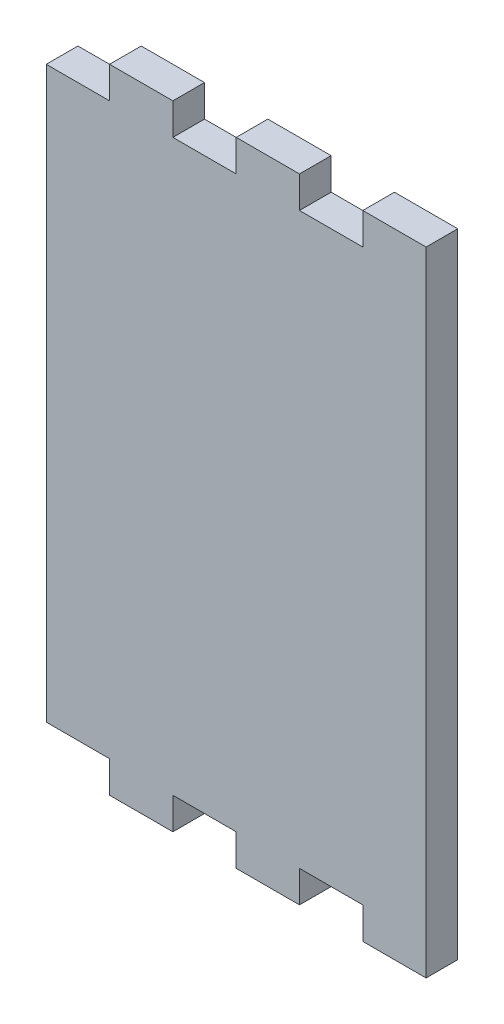
ISO-10303-21;
HEADER;
FILE_DESCRIPTION(('STEP AP214'),'2;1');
FILE_NAME('part.step','',(''),(''),'','','');
FILE_SCHEMA(('AUTOMOTIVE_DESIGN { 1 0 10303 214 1 1 1 1 }'));
ENDSEC;
DATA;
#1=APPLICATION_CONTEXT('core data for automotive mechanical design processes');
#2=APPLICATION_PROTOCOL_DEFINITION('international standard','automotive_design',2000,#1);
#3=PRODUCT_CONTEXT('',#1,'mechanical');
#4=PRODUCT('Part','Part','',(#3));
#5=PRODUCT_RELATED_PRODUCT_CATEGORY('part','',(#4));
#6=PRODUCT_DEFINITION_FORMATION('','',#4);
#7=PRODUCT_DEFINITION_CONTEXT('part definition',#1,'design');
#8=PRODUCT_DEFINITION('design','',#6,#7);
#9=PRODUCT_DEFINITION_SHAPE('','',#8);
#10=(LENGTH_UNIT() NAMED_UNIT(*) SI_UNIT(.MILLI.,.METRE.));
#11=(NAMED_UNIT(*) PLANE_ANGLE_UNIT() SI_UNIT($,.RADIAN.));
#12=(NAMED_UNIT(*) SI_UNIT($,.STERADIAN.) SOLID_ANGLE_UNIT());
#13=UNCERTAINTY_MEASURE_WITH_UNIT(LENGTH_MEASURE(1.E-05),#10,'distance_accuracy_value','');
#14=(GEOMETRIC_REPRESENTATION_CONTEXT(3) GLOBAL_UNCERTAINTY_ASSIGNED_CONTEXT((#13)) GLOBAL_UNIT_ASSIGNED_CONTEXT((#10,
#11,#12)) REPRESENTATION_CONTEXT('',''));
#15=CARTESIAN_POINT('',(0.,0.,0.));
#16=DIRECTION('',(0.,0.,1.));
#17=DIRECTION('',(1.,0.,0.));
#18=AXIS2_PLACEMENT_3D('',#15,#16,#17);
#19=CARTESIAN_POINT('',(0.,0.,0.));
#20=DIRECTION('',(0.,0.,1.));
#21=DIRECTION('',(1.,0.,0.));
#22=AXIS2_PLACEMENT_3D('',#19,#20,#21);
#23=PLANE('',#22);
#24=DIRECTION('',(-1.,0.,0.));
#25=VECTOR('',#24,1.);
#26=CARTESIAN_POINT('',(44.45,-6.35,0.));
#27=LINE('',#26,#25);
#28=CARTESIAN_POINT('',(-31.75,-6.35,0.));
#29=VERTEX_POINT('',#28);
#30=CARTESIAN_POINT('',(-44.45,-6.35,0.));
#31=VERTEX_POINT('',#30);
#32=EDGE_CURVE('E351',#29,#31,#27,.T.);
#33=ORIENTED_EDGE('',*,*,#32,.T.);
#34=DIRECTION('',(0.,-1.,0.));
#35=VECTOR('',#34,1.);
#36=CARTESIAN_POINT('',(-44.45,0.,0.));
#37=LINE('',#36,#35);
#38=CARTESIAN_POINT('',(-44.4499999999999,-120.65,0.));
#39=VERTEX_POINT('',#38);
#40=EDGE_CURVE('E307',#31,#39,#37,.T.);
#41=ORIENTED_EDGE('',*,*,#40,.T.);
#42=DIRECTION('',(1.,0.,0.));
#43=VECTOR('',#42,1.);
#44=CARTESIAN_POINT('',(44.4500000000001,-120.65,0.));
#45=LINE('',#44,#43);
#46=CARTESIAN_POINT('',(-31.7499999999999,-120.65,0.));
#47=VERTEX_POINT('',#46);
#48=EDGE_CURVE('E279',#39,#47,#45,.T.);
#49=ORIENTED_EDGE('',*,*,#48,.T.);
#50=DIRECTION('',(0.,1.,0.));
#51=VECTOR('',#50,1.);
#52=CARTESIAN_POINT('',(-31.7499999999999,-120.65,0.));
#53=LINE('',#52,#51);
#54=CARTESIAN_POINT('',(-31.7499999999999,-127.,0.));
#55=VERTEX_POINT('',#54);
#56=EDGE_CURVE('E272',#55,#47,#53,.T.);
#57=ORIENTED_EDGE('',*,*,#56,.F.);
#58=DIRECTION('',(1.,0.,0.));
#59=VECTOR('',#58,1.);
#60=CARTESIAN_POINT('',(-44.45,-127.,0.));
#61=LINE('',#60,#59);
#62=CARTESIAN_POINT('',(-19.0499999999999,-127.,0.));
#63=VERTEX_POINT('',#62);
#64=EDGE_CURVE('E312',#55,#63,#61,.T.);
#65=ORIENTED_EDGE('',*,*,#64,.T.);
#66=DIRECTION('',(0.,-1.,0.));
#67=VECTOR('',#66,1.);
#68=CARTESIAN_POINT('',(-19.0499999999999,-120.65,0.));
#69=LINE('',#68,#67);
#70=CARTESIAN_POINT('',(-19.0499999999999,-120.65,0.));
#71=VERTEX_POINT('',#70);
#72=EDGE_CURVE('E269',#71,#63,#69,.T.);
#73=ORIENTED_EDGE('',*,*,#72,.F.);
#74=CARTESIAN_POINT('',(-6.34999999999991,-120.65,0.));
#75=VERTEX_POINT('',#74);
#76=EDGE_CURVE('E283',#71,#75,#45,.T.);
#77=ORIENTED_EDGE('',*,*,#76,.T.);
#78=DIRECTION('',(0.,1.,0.));
#79=VECTOR('',#78,1.);
#80=CARTESIAN_POINT('',(-6.34999999999991,-120.65,0.));
#81=LINE('',#80,#79);
#82=CARTESIAN_POINT('',(-6.34999999999991,-127.,0.));
#83=VERTEX_POINT('',#82);
#84=EDGE_CURVE('E254',#83,#75,#81,.T.);
#85=ORIENTED_EDGE('',*,*,#84,.F.);
#86=CARTESIAN_POINT('',(6.35000000000008,-127.,0.));
#87=VERTEX_POINT('',#86);
#88=EDGE_CURVE('E311',#83,#87,#61,.T.);
#89=ORIENTED_EDGE('',*,*,#88,.T.);
#90=DIRECTION('',(0.,-1.,0.));
#91=VECTOR('',#90,1.);
#92=CARTESIAN_POINT('',(6.35000000000008,-120.65,0.));
#93=LINE('',#92,#91);
#94=CARTESIAN_POINT('',(6.35000000000008,-120.65,0.));
#95=VERTEX_POINT('',#94);
#96=EDGE_CURVE('E251',#95,#87,#93,.T.);
#97=ORIENTED_EDGE('',*,*,#96,.F.);
#98=CARTESIAN_POINT('',(19.0500000000001,-120.65,0.));
#99=VERTEX_POINT('',#98);
#100=EDGE_CURVE('E278',#95,#99,#45,.T.);
#101=ORIENTED_EDGE('',*,*,#100,.T.);
#102=DIRECTION('',(0.,1.,0.));
#103=VECTOR('',#102,1.);
#104=CARTESIAN_POINT('',(19.0500000000001,-120.65,0.));
#105=LINE('',#104,#103);
#106=CARTESIAN_POINT('',(19.0500000000001,-127.,0.));
#107=VERTEX_POINT('',#106);
#108=EDGE_CURVE('E235',#107,#99,#105,.T.);
#109=ORIENTED_EDGE('',*,*,#108,.F.);
#110=CARTESIAN_POINT('',(31.7500000000001,-127.,0.));
#111=VERTEX_POINT('',#110);
#112=EDGE_CURVE('E309',#107,#111,#61,.T.);
#113=ORIENTED_EDGE('',*,*,#112,.T.);
#114=DIRECTION('',(0.,1.,0.));
#115=VECTOR('',#114,1.);
#116=CARTESIAN_POINT('',(31.7500000000001,0.,0.));
#117=LINE('',#116,#115);
#118=CARTESIAN_POINT('',(31.7500000000001,0.,0.));
#119=VERTEX_POINT('',#118);
#120=EDGE_CURVE('E313',#111,#119,#117,.T.);
#121=ORIENTED_EDGE('',*,*,#120,.T.);
#122=DIRECTION('',(-1.,0.,0.));
#123=VECTOR('',#122,1.);
#124=CARTESIAN_POINT('',(-44.45,0.,0.));
#125=LINE('',#124,#123);
#126=CARTESIAN_POINT('',(19.05,0.,0.));
#127=VERTEX_POINT('',#126);
#128=EDGE_CURVE('E297',#119,#127,#125,.T.);
#129=ORIENTED_EDGE('',*,*,#128,.T.);
#130=DIRECTION('',(0.,1.,0.));
#131=VECTOR('',#130,1.);
#132=CARTESIAN_POINT('',(19.05,-6.35,0.));
#133=LINE('',#132,#131);
#134=CARTESIAN_POINT('',(19.05,-6.35,0.));
#135=VERTEX_POINT('',#134);
#136=EDGE_CURVE('E204',#135,#127,#133,.T.);
#137=ORIENTED_EDGE('',*,*,#136,.F.);
#138=CARTESIAN_POINT('',(6.34999999999997,-6.35,0.));
#139=VERTEX_POINT('',#138);
#140=EDGE_CURVE('E211',#135,#139,#27,.T.);
#141=ORIENTED_EDGE('',*,*,#140,.T.);
#142=DIRECTION('',(0.,-1.,0.));
#143=VECTOR('',#142,1.);
#144=CARTESIAN_POINT('',(6.34999999999997,-6.35,0.));
#145=LINE('',#144,#143);
#146=CARTESIAN_POINT('',(6.34999999999997,0.,0.));
#147=VERTEX_POINT('',#146);
#148=EDGE_CURVE('E338',#147,#139,#145,.T.);
#149=ORIENTED_EDGE('',*,*,#148,.F.);
#150=CARTESIAN_POINT('',(-6.35000000000002,0.,0.));
#151=VERTEX_POINT('',#150);
#152=EDGE_CURVE('E317',#147,#151,#125,.T.);
#153=ORIENTED_EDGE('',*,*,#152,.T.);
#154=DIRECTION('',(0.,1.,0.));
#155=VECTOR('',#154,1.);
#156=CARTESIAN_POINT('',(-6.35000000000002,-6.35,0.));
#157=LINE('',#156,#155);
#158=CARTESIAN_POINT('',(-6.35000000000002,-6.35,0.));
#159=VERTEX_POINT('',#158);
#160=EDGE_CURVE('E56',#159,#151,#157,.T.);
#161=ORIENTED_EDGE('',*,*,#160,.F.);
#162=CARTESIAN_POINT('',(-19.05,-6.35,0.));
#163=VERTEX_POINT('',#162);
#164=EDGE_CURVE('E353',#159,#163,#27,.T.);
#165=ORIENTED_EDGE('',*,*,#164,.T.);
#166=DIRECTION('',(0.,-1.,0.));
#167=VECTOR('',#166,1.);
#168=CARTESIAN_POINT('',(-19.05,-6.35,0.));
#169=LINE('',#168,#167);
#170=CARTESIAN_POINT('',(-19.05,0.,0.));
#171=VERTEX_POINT('',#170);
#172=EDGE_CURVE('E327',#171,#163,#169,.T.);
#173=ORIENTED_EDGE('',*,*,#172,.F.);
#174=CARTESIAN_POINT('',(-31.75,0.,0.));
#175=VERTEX_POINT('',#174);
#176=EDGE_CURVE('E315',#171,#175,#125,.T.);
#177=ORIENTED_EDGE('',*,*,#176,.T.);
#178=DIRECTION('',(0.,1.,0.));
#179=VECTOR('',#178,1.);
#180=CARTESIAN_POINT('',(-31.75,-6.35,0.));
#181=LINE('',#180,#179);
#182=EDGE_CURVE('E48',#29,#175,#181,.T.);
#183=ORIENTED_EDGE('',*,*,#182,.F.);
#184=EDGE_LOOP('',(#33,#41,#49,#57,#65,#73,#77,#85,#89,#97,#101,#109,#113,#121,#129,#137,#141,
#149,#153,#161,#165,#173,#177,#183));
#185=FACE_BOUND('',#184,.T.);
#186=ADVANCED_FACE('F33',(#185),#23,.T.);
#187=CARTESIAN_POINT('',(-44.45,0.,-6.35));
#188=DIRECTION('',(0.,1.,0.));
#189=DIRECTION('',(0.,0.,1.));
#190=AXIS2_PLACEMENT_3D('',#187,#188,#189);
#191=PLANE('',#190);
#192=DIRECTION('',(-1.,0.,0.));
#193=VECTOR('',#192,1.);
#194=CARTESIAN_POINT('',(-44.45,0.,-6.35));
#195=LINE('',#194,#193);
#196=CARTESIAN_POINT('',(-19.05,0.,-6.34999999999998));
#197=VERTEX_POINT('',#196);
#198=CARTESIAN_POINT('',(-31.75,0.,-6.34999999999998));
#199=VERTEX_POINT('',#198);
#200=EDGE_CURVE('E303',#197,#199,#195,.T.);
#201=ORIENTED_EDGE('',*,*,#200,.T.);
#202=DIRECTION('',(0.,0.,1.));
#203=VECTOR('',#202,1.);
#204=CARTESIAN_POINT('',(-31.75,0.,6.35000000000002));
#205=LINE('',#204,#203);
#206=EDGE_CURVE('E333',#199,#175,#205,.T.);
#207=ORIENTED_EDGE('',*,*,#206,.T.);
#208=ORIENTED_EDGE('',*,*,#176,.F.);
#209=DIRECTION('',(0.,0.,1.));
#210=VECTOR('',#209,1.);
#211=CARTESIAN_POINT('',(-19.05,0.,-23.8125000000001));
#212=LINE('',#211,#210);
#213=EDGE_CURVE('E224',#197,#171,#212,.T.);
#214=ORIENTED_EDGE('',*,*,#213,.F.);
#215=EDGE_LOOP('',(#201,#207,#208,#214));
#216=FACE_BOUND('',#215,.T.);
#217=ADVANCED_FACE('F331',(#216),#191,.T.);
#218=CARTESIAN_POINT('',(6.34999999999997,0.,-6.34999999999998));
#219=VERTEX_POINT('',#218);
#220=CARTESIAN_POINT('',(-6.35000000000002,0.,-6.34999999999998));
#221=VERTEX_POINT('',#220);
#222=EDGE_CURVE('E306',#219,#221,#195,.T.);
#223=ORIENTED_EDGE('',*,*,#222,.T.);
#224=DIRECTION('',(0.,0.,1.));
#225=VECTOR('',#224,1.);
#226=CARTESIAN_POINT('',(-6.35000000000002,0.,6.35000000000002));
#227=LINE('',#226,#225);
#228=EDGE_CURVE('E364',#221,#151,#227,.T.);
#229=ORIENTED_EDGE('',*,*,#228,.T.);
#230=ORIENTED_EDGE('',*,*,#152,.F.);
#231=DIRECTION('',(0.,0.,1.));
#232=VECTOR('',#231,1.);
#233=CARTESIAN_POINT('',(6.34999999999999,0.,-23.8125));
#234=LINE('',#233,#232);
#235=EDGE_CURVE('E220',#219,#147,#234,.T.);
#236=ORIENTED_EDGE('',*,*,#235,.F.);
#237=EDGE_LOOP('',(#223,#229,#230,#236));
#238=FACE_BOUND('',#237,.T.);
#239=ADVANCED_FACE('F362',(#238),#191,.T.);
#240=CARTESIAN_POINT('',(31.7500000000001,0.,-6.35));
#241=VERTEX_POINT('',#240);
#242=CARTESIAN_POINT('',(19.05,0.,-6.34999999999997));
#243=VERTEX_POINT('',#242);
#244=EDGE_CURVE('E304',#241,#243,#195,.T.);
#245=ORIENTED_EDGE('',*,*,#244,.T.);
#246=DIRECTION('',(0.,0.,1.));
#247=VECTOR('',#246,1.);
#248=CARTESIAN_POINT('',(19.05,0.,6.35000000000003));
#249=LINE('',#248,#247);
#250=EDGE_CURVE('E199',#243,#127,#249,.T.);
#251=ORIENTED_EDGE('',*,*,#250,.T.);
#252=ORIENTED_EDGE('',*,*,#128,.F.);
#253=DIRECTION('',(0.,0.,1.));
#254=VECTOR('',#253,1.);
#255=CARTESIAN_POINT('',(31.7500000000001,0.,-6.35));
#256=LINE('',#255,#254);
#257=EDGE_CURVE('E11',#241,#119,#256,.T.);
#258=ORIENTED_EDGE('',*,*,#257,.F.);
#259=EDGE_LOOP('',(#245,#251,#252,#258));
#260=FACE_BOUND('',#259,.T.);
#261=ADVANCED_FACE('F379',(#260),#191,.T.);
#262=CARTESIAN_POINT('',(-44.45,-127.,-6.35));
#263=DIRECTION('',(0.,-1.,0.));
#264=DIRECTION('',(0.,0.,-1.));
#265=AXIS2_PLACEMENT_3D('',#262,#263,#264);
#266=PLANE('',#265);
#267=ORIENTED_EDGE('',*,*,#64,.F.);
#268=DIRECTION('',(0.,0.,1.));
#269=VECTOR('',#268,1.);
#270=CARTESIAN_POINT('',(-31.7499999999999,-127.,-23.8125000000001));
#271=LINE('',#270,#269);
#272=CARTESIAN_POINT('',(-31.7499999999999,-127.,-6.35));
#273=VERTEX_POINT('',#272);
#274=EDGE_CURVE('E282',#273,#55,#271,.T.);
#275=ORIENTED_EDGE('',*,*,#274,.F.);
#276=DIRECTION('',(1.,0.,0.));
#277=VECTOR('',#276,1.);
#278=CARTESIAN_POINT('',(-44.45,-127.,-6.35));
#279=LINE('',#278,#277);
#280=CARTESIAN_POINT('',(-19.0499999999999,-127.,-6.34999999999999));
#281=VERTEX_POINT('',#280);
#282=EDGE_CURVE('E300',#273,#281,#279,.T.);
#283=ORIENTED_EDGE('',*,*,#282,.T.);
#284=DIRECTION('',(0.,0.,1.));
#285=VECTOR('',#284,1.);
#286=CARTESIAN_POINT('',(-19.0499999999999,-127.,-6.34999999999999));
#287=LINE('',#286,#285);
#288=EDGE_CURVE('E257',#281,#63,#287,.T.);
#289=ORIENTED_EDGE('',*,*,#288,.T.);
#290=EDGE_LOOP('',(#267,#275,#283,#289));
#291=FACE_BOUND('',#290,.T.);
#292=ADVANCED_FACE('F424',(#291),#266,.T.);
#293=ORIENTED_EDGE('',*,*,#88,.F.);
#294=DIRECTION('',(0.,0.,1.));
#295=VECTOR('',#294,1.);
#296=CARTESIAN_POINT('',(-6.3499999999999,-127.,-23.8125));
#297=LINE('',#296,#295);
#298=CARTESIAN_POINT('',(-6.34999999999991,-127.,-6.35));
#299=VERTEX_POINT('',#298);
#300=EDGE_CURVE('E285',#299,#83,#297,.T.);
#301=ORIENTED_EDGE('',*,*,#300,.F.);
#302=CARTESIAN_POINT('',(6.35000000000009,-127.,-6.34999999999999));
#303=VERTEX_POINT('',#302);
#304=EDGE_CURVE('E299',#299,#303,#279,.T.);
#305=ORIENTED_EDGE('',*,*,#304,.T.);
#306=DIRECTION('',(0.,0.,1.));
#307=VECTOR('',#306,1.);
#308=CARTESIAN_POINT('',(6.35000000000009,-127.,-6.34999999999999));
#309=LINE('',#308,#307);
#310=EDGE_CURVE('E239',#303,#87,#309,.T.);
#311=ORIENTED_EDGE('',*,*,#310,.T.);
#312=EDGE_LOOP('',(#293,#301,#305,#311));
#313=FACE_BOUND('',#312,.T.);
#314=ADVANCED_FACE('F417',(#313),#266,.T.);
#315=ORIENTED_EDGE('',*,*,#112,.F.);
#316=DIRECTION('',(0.,0.,1.));
#317=VECTOR('',#316,1.);
#318=CARTESIAN_POINT('',(19.0500000000001,-127.,-23.8125));
#319=LINE('',#318,#317);
#320=CARTESIAN_POINT('',(19.0500000000001,-127.,-6.35));
#321=VERTEX_POINT('',#320);
#322=EDGE_CURVE('E287',#321,#107,#319,.T.);
#323=ORIENTED_EDGE('',*,*,#322,.F.);
#324=CARTESIAN_POINT('',(31.7500000000001,-127.,-6.35));
#325=VERTEX_POINT('',#324);
#326=EDGE_CURVE('E296',#321,#325,#279,.T.);
#327=ORIENTED_EDGE('',*,*,#326,.T.);
#328=DIRECTION('',(0.,0.,1.));
#329=VECTOR('',#328,1.);
#330=CARTESIAN_POINT('',(31.7500000000001,-127.,-6.35));
#331=LINE('',#330,#329);
#332=EDGE_CURVE('E37',#325,#111,#331,.T.);
#333=ORIENTED_EDGE('',*,*,#332,.T.);
#334=EDGE_LOOP('',(#315,#323,#327,#333));
#335=FACE_BOUND('',#334,.T.);
#336=ADVANCED_FACE('F390',(#335),#266,.T.);
#337=CARTESIAN_POINT('',(0.,0.,-6.35));
#338=DIRECTION('',(0.,0.,1.));
#339=DIRECTION('',(1.,0.,0.));
#340=AXIS2_PLACEMENT_3D('',#337,#338,#339);
#341=PLANE('',#340);
#342=DIRECTION('',(0.,-1.,0.));
#343=VECTOR('',#342,1.);
#344=CARTESIAN_POINT('',(-44.45,0.,-6.35));
#345=LINE('',#344,#343);
#346=CARTESIAN_POINT('',(-44.45,-6.35,-6.35));
#347=VERTEX_POINT('',#346);
#348=CARTESIAN_POINT('',(-44.4499999999999,-120.65,-6.35));
#349=VERTEX_POINT('',#348);
#350=EDGE_CURVE('E294',#347,#349,#345,.T.);
#351=ORIENTED_EDGE('',*,*,#350,.F.);
#352=DIRECTION('',(1.,0.,0.));
#353=VECTOR('',#352,1.);
#354=CARTESIAN_POINT('',(0.,-6.35,-6.35));
#355=LINE('',#354,#353);
#356=CARTESIAN_POINT('',(-31.75,-6.35,-6.34999999999998));
#357=VERTEX_POINT('',#356);
#358=EDGE_CURVE('E222',#347,#357,#355,.T.);
#359=ORIENTED_EDGE('',*,*,#358,.T.);
#360=DIRECTION('',(0.,1.,0.));
#361=VECTOR('',#360,1.);
#362=CARTESIAN_POINT('',(-31.75,-6.35,-6.34999999999998));
#363=LINE('',#362,#361);
#364=EDGE_CURVE('E342',#357,#199,#363,.T.);
#365=ORIENTED_EDGE('',*,*,#364,.T.);
#366=ORIENTED_EDGE('',*,*,#200,.F.);
#367=DIRECTION('',(0.,1.,0.));
#368=VECTOR('',#367,1.);
#369=CARTESIAN_POINT('',(-19.05,-6.35,-6.34999999999998));
#370=LINE('',#369,#368);
#371=CARTESIAN_POINT('',(-19.05,-6.35,-6.34999999999998));
#372=VERTEX_POINT('',#371);
#373=EDGE_CURVE('E344',#372,#197,#370,.T.);
#374=ORIENTED_EDGE('',*,*,#373,.F.);
#375=CARTESIAN_POINT('',(-6.35000000000002,-6.35,-6.34999999999998));
#376=VERTEX_POINT('',#375);
#377=EDGE_CURVE('E219',#372,#376,#355,.T.);
#378=ORIENTED_EDGE('',*,*,#377,.T.);
#379=DIRECTION('',(0.,1.,0.));
#380=VECTOR('',#379,1.);
#381=CARTESIAN_POINT('',(-6.35000000000002,-6.35,-6.34999999999998));
#382=LINE('',#381,#380);
#383=EDGE_CURVE('E365',#376,#221,#382,.T.);
#384=ORIENTED_EDGE('',*,*,#383,.T.);
#385=ORIENTED_EDGE('',*,*,#222,.F.);
#386=DIRECTION('',(0.,1.,0.));
#387=VECTOR('',#386,1.);
#388=CARTESIAN_POINT('',(6.34999999999997,-6.35,-6.34999999999998));
#389=LINE('',#388,#387);
#390=CARTESIAN_POINT('',(6.34999999999997,-6.35,-6.34999999999998));
#391=VERTEX_POINT('',#390);
#392=EDGE_CURVE('E218',#391,#219,#389,.T.);
#393=ORIENTED_EDGE('',*,*,#392,.F.);
#394=CARTESIAN_POINT('',(19.05,-6.35,-6.34999999999997));
#395=VERTEX_POINT('',#394);
#396=EDGE_CURVE('E208',#391,#395,#355,.T.);
#397=ORIENTED_EDGE('',*,*,#396,.T.);
#398=DIRECTION('',(0.,1.,0.));
#399=VECTOR('',#398,1.);
#400=CARTESIAN_POINT('',(19.05,-6.35,-6.34999999999997));
#401=LINE('',#400,#399);
#402=EDGE_CURVE('E193',#395,#243,#401,.T.);
#403=ORIENTED_EDGE('',*,*,#402,.T.);
#404=ORIENTED_EDGE('',*,*,#244,.F.);
#405=DIRECTION('',(0.,1.,0.));
#406=VECTOR('',#405,1.);
#407=CARTESIAN_POINT('',(31.7500000000001,0.,-6.35));
#408=LINE('',#407,#406);
#409=EDGE_CURVE('E301',#325,#241,#408,.T.);
#410=ORIENTED_EDGE('',*,*,#409,.F.);
#411=ORIENTED_EDGE('',*,*,#326,.F.);
#412=DIRECTION('',(0.,-1.,0.));
#413=VECTOR('',#412,1.);
#414=CARTESIAN_POINT('',(19.0500000000001,-120.65,-6.35));
#415=LINE('',#414,#413);
#416=CARTESIAN_POINT('',(19.0500000000001,-120.65,-6.35));
#417=VERTEX_POINT('',#416);
#418=EDGE_CURVE('E231',#417,#321,#415,.T.);
#419=ORIENTED_EDGE('',*,*,#418,.F.);
#420=DIRECTION('',(-1.,0.,0.));
#421=VECTOR('',#420,1.);
#422=CARTESIAN_POINT('',(0.,-120.65,-6.35));
#423=LINE('',#422,#421);
#424=CARTESIAN_POINT('',(6.35000000000009,-120.65,-6.34999999999999));
#425=VERTEX_POINT('',#424);
#426=EDGE_CURVE('E293',#417,#425,#423,.T.);
#427=ORIENTED_EDGE('',*,*,#426,.T.);
#428=DIRECTION('',(0.,-1.,0.));
#429=VECTOR('',#428,1.);
#430=CARTESIAN_POINT('',(6.35000000000009,-120.65,-6.34999999999999));
#431=LINE('',#430,#429);
#432=EDGE_CURVE('E248',#425,#303,#431,.T.);
#433=ORIENTED_EDGE('',*,*,#432,.T.);
#434=ORIENTED_EDGE('',*,*,#304,.F.);
#435=DIRECTION('',(0.,-1.,0.));
#436=VECTOR('',#435,1.);
#437=CARTESIAN_POINT('',(-6.34999999999991,-120.65,-6.35));
#438=LINE('',#437,#436);
#439=CARTESIAN_POINT('',(-6.34999999999991,-120.65,-6.35));
#440=VERTEX_POINT('',#439);
#441=EDGE_CURVE('E245',#440,#299,#438,.T.);
#442=ORIENTED_EDGE('',*,*,#441,.F.);
#443=CARTESIAN_POINT('',(-19.0499999999999,-120.65,-6.34999999999999));
#444=VERTEX_POINT('',#443);
#445=EDGE_CURVE('E292',#440,#444,#423,.T.);
#446=ORIENTED_EDGE('',*,*,#445,.T.);
#447=DIRECTION('',(0.,-1.,0.));
#448=VECTOR('',#447,1.);
#449=CARTESIAN_POINT('',(-19.0499999999999,-120.65,-6.34999999999999));
#450=LINE('',#449,#448);
#451=EDGE_CURVE('E266',#444,#281,#450,.T.);
#452=ORIENTED_EDGE('',*,*,#451,.T.);
#453=ORIENTED_EDGE('',*,*,#282,.F.);
#454=DIRECTION('',(0.,-1.,0.));
#455=VECTOR('',#454,1.);
#456=CARTESIAN_POINT('',(-31.7499999999999,-120.65,-6.35));
#457=LINE('',#456,#455);
#458=CARTESIAN_POINT('',(-31.7499999999999,-120.65,-6.35));
#459=VERTEX_POINT('',#458);
#460=EDGE_CURVE('E263',#459,#273,#457,.T.);
#461=ORIENTED_EDGE('',*,*,#460,.F.);
#462=EDGE_CURVE('E289',#459,#349,#423,.T.);
#463=ORIENTED_EDGE('',*,*,#462,.T.);
#464=EDGE_LOOP('',(#351,#359,#365,#366,#374,#378,#384,#385,#393,#397,#403,#404,#410,#411,#419,
#427,#433,#434,#442,#446,#452,#453,#461,#463));
#465=FACE_BOUND('',#464,.T.);
#466=ADVANCED_FACE('F216',(#465),#341,.F.);
#467=CARTESIAN_POINT('',(-44.45,0.,-6.35));
#468=DIRECTION('',(-1.,0.,0.));
#469=DIRECTION('',(0.,0.,1.));
#470=AXIS2_PLACEMENT_3D('',#467,#468,#469);
#471=PLANE('',#470);
#472=DIRECTION('',(0.,0.,-1.));
#473=VECTOR('',#472,1.);
#474=CARTESIAN_POINT('',(-44.45,-6.35,0.));
#475=LINE('',#474,#473);
#476=EDGE_CURVE('E348',#31,#347,#475,.T.);
#477=ORIENTED_EDGE('',*,*,#476,.T.);
#478=ORIENTED_EDGE('',*,*,#350,.T.);
#479=DIRECTION('',(0.,0.,1.));
#480=VECTOR('',#479,1.);
#481=CARTESIAN_POINT('',(-44.4499999999999,-120.65,-47.625));
#482=LINE('',#481,#480);
#483=EDGE_CURVE('E275',#349,#39,#482,.T.);
#484=ORIENTED_EDGE('',*,*,#483,.T.);
#485=ORIENTED_EDGE('',*,*,#40,.F.);
#486=EDGE_LOOP('',(#477,#478,#484,#485));
#487=FACE_BOUND('',#486,.T.);
#488=ADVANCED_FACE('F35',(#487),#471,.T.);
#489=CARTESIAN_POINT('',(31.7500000000001,0.,-6.35));
#490=DIRECTION('',(1.,0.,0.));
#491=DIRECTION('',(0.,0.,-1.));
#492=AXIS2_PLACEMENT_3D('',#489,#490,#491);
#493=PLANE('',#492);
#494=ORIENTED_EDGE('',*,*,#409,.T.);
#495=ORIENTED_EDGE('',*,*,#257,.T.);
#496=ORIENTED_EDGE('',*,*,#120,.F.);
#497=ORIENTED_EDGE('',*,*,#332,.F.);
#498=EDGE_LOOP('',(#494,#495,#496,#497));
#499=FACE_BOUND('',#498,.T.);
#500=ADVANCED_FACE('F385',(#499),#493,.T.);
#501=CARTESIAN_POINT('',(6.35000000000009,-120.65,-6.34999999999999));
#502=DIRECTION('',(1.,0.,0.));
#503=DIRECTION('',(0.,0.,-1.));
#504=AXIS2_PLACEMENT_3D('',#501,#502,#503);
#505=PLANE('',#504);
#506=DIRECTION('',(0.,0.,1.));
#507=VECTOR('',#506,1.);
#508=CARTESIAN_POINT('',(6.35000000000009,-120.65,-6.34999999999999));
#509=LINE('',#508,#507);
#510=EDGE_CURVE('E243',#425,#95,#509,.T.);
#511=ORIENTED_EDGE('',*,*,#510,.T.);
#512=ORIENTED_EDGE('',*,*,#96,.T.);
#513=ORIENTED_EDGE('',*,*,#310,.F.);
#514=ORIENTED_EDGE('',*,*,#432,.F.);
#515=EDGE_LOOP('',(#511,#512,#513,#514));
#516=FACE_BOUND('',#515,.T.);
#517=ADVANCED_FACE('F448',(#516),#505,.T.);
#518=CARTESIAN_POINT('',(19.0500000000001,-120.65,-6.35));
#519=DIRECTION('',(-1.,0.,0.));
#520=DIRECTION('',(0.,0.,1.));
#521=AXIS2_PLACEMENT_3D('',#518,#519,#520);
#522=PLANE('',#521);
#523=ORIENTED_EDGE('',*,*,#322,.T.);
#524=ORIENTED_EDGE('',*,*,#108,.T.);
#525=DIRECTION('',(0.,0.,-1.));
#526=VECTOR('',#525,1.);
#527=CARTESIAN_POINT('',(19.0500000000001,-120.65,-6.35));
#528=LINE('',#527,#526);
#529=EDGE_CURVE('E228',#99,#417,#528,.T.);
#530=ORIENTED_EDGE('',*,*,#529,.T.);
#531=ORIENTED_EDGE('',*,*,#418,.T.);
#532=EDGE_LOOP('',(#523,#524,#530,#531));
#533=FACE_BOUND('',#532,.T.);
#534=ADVANCED_FACE('F393',(#533),#522,.T.);
#535=CARTESIAN_POINT('',(44.4500000000001,-120.65,-23.8125));
#536=DIRECTION('',(0.,1.,0.));
#537=DIRECTION('',(-1.,0.,0.));
#538=AXIS2_PLACEMENT_3D('',#535,#536,#537);
#539=PLANE('',#538);
#540=ORIENTED_EDGE('',*,*,#529,.F.);
#541=ORIENTED_EDGE('',*,*,#100,.F.);
#542=ORIENTED_EDGE('',*,*,#510,.F.);
#543=ORIENTED_EDGE('',*,*,#426,.F.);
#544=EDGE_LOOP('',(#540,#541,#542,#543));
#545=FACE_BOUND('',#544,.T.);
#546=ADVANCED_FACE('F429',(#545),#539,.F.);
#547=CARTESIAN_POINT('',(-19.0499999999999,-120.65,-6.34999999999999));
#548=DIRECTION('',(1.,0.,0.));
#549=DIRECTION('',(0.,0.,-1.));
#550=AXIS2_PLACEMENT_3D('',#547,#548,#549);
#551=PLANE('',#550);
#552=DIRECTION('',(0.,0.,1.));
#553=VECTOR('',#552,1.);
#554=CARTESIAN_POINT('',(-19.0499999999999,-120.65,-6.34999999999999));
#555=LINE('',#554,#553);
#556=EDGE_CURVE('E261',#444,#71,#555,.T.);
#557=ORIENTED_EDGE('',*,*,#556,.T.);
#558=ORIENTED_EDGE('',*,*,#72,.T.);
#559=ORIENTED_EDGE('',*,*,#288,.F.);
#560=ORIENTED_EDGE('',*,*,#451,.F.);
#561=EDGE_LOOP('',(#557,#558,#559,#560));
#562=FACE_BOUND('',#561,.T.);
#563=ADVANCED_FACE('F427',(#562),#551,.T.);
#564=CARTESIAN_POINT('',(-6.34999999999991,-120.65,-6.35));
#565=DIRECTION('',(-1.,0.,0.));
#566=DIRECTION('',(0.,0.,1.));
#567=AXIS2_PLACEMENT_3D('',#564,#565,#566);
#568=PLANE('',#567);
#569=ORIENTED_EDGE('',*,*,#300,.T.);
#570=ORIENTED_EDGE('',*,*,#84,.T.);
#571=DIRECTION('',(0.,0.,-1.));
#572=VECTOR('',#571,1.);
#573=CARTESIAN_POINT('',(-6.34999999999991,-120.65,-6.35));
#574=LINE('',#573,#572);
#575=EDGE_CURVE('E240',#75,#440,#574,.T.);
#576=ORIENTED_EDGE('',*,*,#575,.T.);
#577=ORIENTED_EDGE('',*,*,#441,.T.);
#578=EDGE_LOOP('',(#569,#570,#576,#577));
#579=FACE_BOUND('',#578,.T.);
#580=ADVANCED_FACE('F412',(#579),#568,.T.);
#581=ORIENTED_EDGE('',*,*,#575,.F.);
#582=ORIENTED_EDGE('',*,*,#76,.F.);
#583=ORIENTED_EDGE('',*,*,#556,.F.);
#584=ORIENTED_EDGE('',*,*,#445,.F.);
#585=EDGE_LOOP('',(#581,#582,#583,#584));
#586=FACE_BOUND('',#585,.T.);
#587=ADVANCED_FACE('F408',(#586),#539,.F.);
#588=DIRECTION('',(0.,0.,-1.));
#589=VECTOR('',#588,1.);
#590=CARTESIAN_POINT('',(-31.7499999999999,-120.65,-6.35));
#591=LINE('',#590,#589);
#592=EDGE_CURVE('E258',#47,#459,#591,.T.);
#593=ORIENTED_EDGE('',*,*,#592,.F.);
#594=ORIENTED_EDGE('',*,*,#48,.F.);
#595=ORIENTED_EDGE('',*,*,#483,.F.);
#596=ORIENTED_EDGE('',*,*,#462,.F.);
#597=EDGE_LOOP('',(#593,#594,#595,#596));
#598=FACE_BOUND('',#597,.T.);
#599=ADVANCED_FACE('F437',(#598),#539,.F.);
#600=CARTESIAN_POINT('',(-31.7499999999999,-120.65,-6.35));
#601=DIRECTION('',(-1.,0.,0.));
#602=DIRECTION('',(0.,0.,1.));
#603=AXIS2_PLACEMENT_3D('',#600,#601,#602);
#604=PLANE('',#603);
#605=ORIENTED_EDGE('',*,*,#274,.T.);
#606=ORIENTED_EDGE('',*,*,#56,.T.);
#607=ORIENTED_EDGE('',*,*,#592,.T.);
#608=ORIENTED_EDGE('',*,*,#460,.T.);
#609=EDGE_LOOP('',(#605,#606,#607,#608));
#610=FACE_BOUND('',#609,.T.);
#611=ADVANCED_FACE('F471',(#610),#604,.T.);
#612=CARTESIAN_POINT('',(19.05,-6.35,6.35000000000003));
#613=DIRECTION('',(-1.,0.,0.));
#614=DIRECTION('',(0.,1.,0.));
#615=AXIS2_PLACEMENT_3D('',#612,#613,#614);
#616=PLANE('',#615);
#617=DIRECTION('',(0.,0.,1.));
#618=VECTOR('',#617,1.);
#619=CARTESIAN_POINT('',(19.05,-6.35,6.35000000000003));
#620=LINE('',#619,#618);
#621=EDGE_CURVE('E196',#395,#135,#620,.T.);
#622=ORIENTED_EDGE('',*,*,#621,.T.);
#623=ORIENTED_EDGE('',*,*,#136,.T.);
#624=ORIENTED_EDGE('',*,*,#250,.F.);
#625=ORIENTED_EDGE('',*,*,#402,.F.);
#626=EDGE_LOOP('',(#622,#623,#624,#625));
#627=FACE_BOUND('',#626,.T.);
#628=ADVANCED_FACE('F195',(#627),#616,.T.);
#629=CARTESIAN_POINT('',(6.34999999999996,-6.35,6.35000000000002));
#630=DIRECTION('',(1.,0.,0.));
#631=DIRECTION('',(0.,0.,1.));
#632=AXIS2_PLACEMENT_3D('',#629,#630,#631);
#633=PLANE('',#632);
#634=ORIENTED_EDGE('',*,*,#235,.T.);
#635=ORIENTED_EDGE('',*,*,#148,.T.);
#636=DIRECTION('',(0.,0.,-1.));
#637=VECTOR('',#636,1.);
#638=CARTESIAN_POINT('',(6.34999999999996,-6.35,6.35000000000002));
#639=LINE('',#638,#637);
#640=EDGE_CURVE('E370',#139,#391,#639,.T.);
#641=ORIENTED_EDGE('',*,*,#640,.T.);
#642=ORIENTED_EDGE('',*,*,#392,.T.);
#643=EDGE_LOOP('',(#634,#635,#641,#642));
#644=FACE_BOUND('',#643,.T.);
#645=ADVANCED_FACE('F485',(#644),#633,.T.);
#646=CARTESIAN_POINT('',(44.45,-6.35,-23.8125));
#647=DIRECTION('',(0.,-1.,0.));
#648=DIRECTION('',(-1.,0.,0.));
#649=AXIS2_PLACEMENT_3D('',#646,#647,#648);
#650=PLANE('',#649);
#651=ORIENTED_EDGE('',*,*,#640,.F.);
#652=ORIENTED_EDGE('',*,*,#140,.F.);
#653=ORIENTED_EDGE('',*,*,#621,.F.);
#654=ORIENTED_EDGE('',*,*,#396,.F.);
#655=EDGE_LOOP('',(#651,#652,#653,#654));
#656=FACE_BOUND('',#655,.T.);
#657=ADVANCED_FACE('F207',(#656),#650,.F.);
#658=CARTESIAN_POINT('',(-6.35000000000002,-6.35,6.35000000000002));
#659=DIRECTION('',(-1.,0.,0.));
#660=DIRECTION('',(0.,1.,0.));
#661=AXIS2_PLACEMENT_3D('',#658,#659,#660);
#662=PLANE('',#661);
#663=DIRECTION('',(0.,0.,1.));
#664=VECTOR('',#663,1.);
#665=CARTESIAN_POINT('',(-6.35000000000002,-6.35,6.35000000000002));
#666=LINE('',#665,#664);
#667=EDGE_CURVE('E374',#376,#159,#666,.T.);
#668=ORIENTED_EDGE('',*,*,#667,.T.);
#669=ORIENTED_EDGE('',*,*,#160,.T.);
#670=ORIENTED_EDGE('',*,*,#228,.F.);
#671=ORIENTED_EDGE('',*,*,#383,.F.);
#672=EDGE_LOOP('',(#668,#669,#670,#671));
#673=FACE_BOUND('',#672,.T.);
#674=ADVANCED_FACE('F477',(#673),#662,.T.);
#675=CARTESIAN_POINT('',(-19.05,-6.35,6.35000000000001));
#676=DIRECTION('',(1.,0.,0.));
#677=DIRECTION('',(0.,0.,1.));
#678=AXIS2_PLACEMENT_3D('',#675,#676,#677);
#679=PLANE('',#678);
#680=ORIENTED_EDGE('',*,*,#213,.T.);
#681=ORIENTED_EDGE('',*,*,#172,.T.);
#682=DIRECTION('',(0.,0.,-1.));
#683=VECTOR('',#682,1.);
#684=CARTESIAN_POINT('',(-19.05,-6.35,6.35000000000001));
#685=LINE('',#684,#683);
#686=EDGE_CURVE('E336',#163,#372,#685,.T.);
#687=ORIENTED_EDGE('',*,*,#686,.T.);
#688=ORIENTED_EDGE('',*,*,#373,.T.);
#689=EDGE_LOOP('',(#680,#681,#687,#688));
#690=FACE_BOUND('',#689,.T.);
#691=ADVANCED_FACE('F355',(#690),#679,.T.);
#692=ORIENTED_EDGE('',*,*,#686,.F.);
#693=ORIENTED_EDGE('',*,*,#164,.F.);
#694=ORIENTED_EDGE('',*,*,#667,.F.);
#695=ORIENTED_EDGE('',*,*,#377,.F.);
#696=EDGE_LOOP('',(#692,#693,#694,#695));
#697=FACE_BOUND('',#696,.T.);
#698=ADVANCED_FACE('F476',(#697),#650,.F.);
#699=ORIENTED_EDGE('',*,*,#476,.F.);
#700=ORIENTED_EDGE('',*,*,#32,.F.);
#701=DIRECTION('',(0.,0.,1.));
#702=VECTOR('',#701,1.);
#703=CARTESIAN_POINT('',(-31.75,-6.35,6.35000000000002));
#704=LINE('',#703,#702);
#705=EDGE_CURVE('E334',#357,#29,#704,.T.);
#706=ORIENTED_EDGE('',*,*,#705,.F.);
#707=ORIENTED_EDGE('',*,*,#358,.F.);
#708=EDGE_LOOP('',(#699,#700,#706,#707));
#709=FACE_BOUND('',#708,.T.);
#710=ADVANCED_FACE('F487',(#709),#650,.F.);
#711=CARTESIAN_POINT('',(-31.75,-6.35,6.35000000000002));
#712=DIRECTION('',(-1.,0.,0.));
#713=DIRECTION('',(0.,1.,0.));
#714=AXIS2_PLACEMENT_3D('',#711,#712,#713);
#715=PLANE('',#714);
#716=ORIENTED_EDGE('',*,*,#705,.T.);
#717=ORIENTED_EDGE('',*,*,#182,.T.);
#718=ORIENTED_EDGE('',*,*,#206,.F.);
#719=ORIENTED_EDGE('',*,*,#364,.F.);
#720=EDGE_LOOP('',(#716,#717,#718,#719));
#721=FACE_BOUND('',#720,.T.);
#722=ADVANCED_FACE('F491',(#721),#715,.T.);
#723=CLOSED_SHELL('',(#186,#217,#239,#261,#292,#314,#336,#466,#488,#500,#517,#534,#546,#563,
#580,#587,#599,#611,#628,#645,#657,#674,#691,#698,#710,#722));
#724=MANIFOLD_SOLID_BREP('B2',#723);
#725=ADVANCED_BREP_SHAPE_REPRESENTATION('',(#18,#724),#14);
#726=SHAPE_DEFINITION_REPRESENTATION(#9,#725);
ENDSEC;
END-ISO-10303-21;
